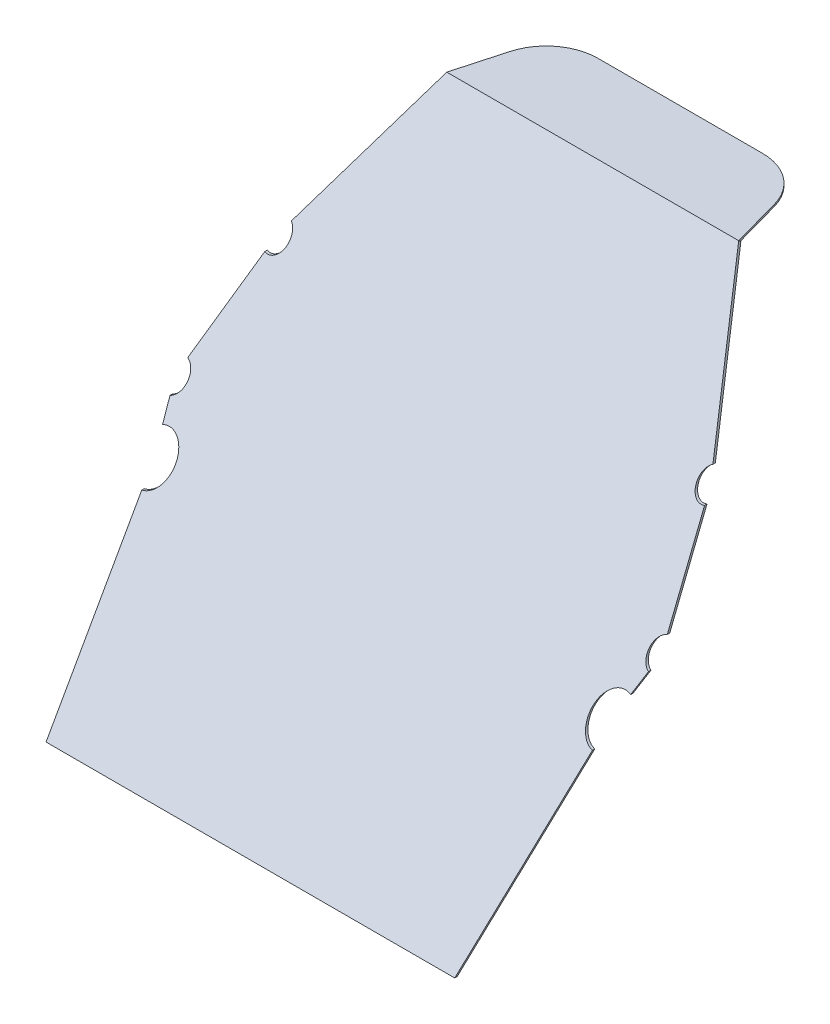
ISO-10303-21;
HEADER;
FILE_DESCRIPTION(('STEP AP214'),'2;1');
FILE_NAME('part.step','',(''),(''),'','','');
FILE_SCHEMA(('AUTOMOTIVE_DESIGN { 1 0 10303 214 1 1 1 1 }'));
ENDSEC;
DATA;
#1=APPLICATION_CONTEXT('core data for automotive mechanical design processes');
#2=APPLICATION_PROTOCOL_DEFINITION('international standard','automotive_design',2000,#1);
#3=PRODUCT_CONTEXT('',#1,'mechanical');
#4=PRODUCT('Part','Part','',(#3));
#5=PRODUCT_RELATED_PRODUCT_CATEGORY('part','',(#4));
#6=PRODUCT_DEFINITION_FORMATION('','',#4);
#7=PRODUCT_DEFINITION_CONTEXT('part definition',#1,'design');
#8=PRODUCT_DEFINITION('design','',#6,#7);
#9=PRODUCT_DEFINITION_SHAPE('','',#8);
#10=(LENGTH_UNIT() NAMED_UNIT(*) SI_UNIT(.MILLI.,.METRE.));
#11=(NAMED_UNIT(*) PLANE_ANGLE_UNIT() SI_UNIT($,.RADIAN.));
#12=(NAMED_UNIT(*) SI_UNIT($,.STERADIAN.) SOLID_ANGLE_UNIT());
#13=UNCERTAINTY_MEASURE_WITH_UNIT(LENGTH_MEASURE(1.E-05),#10,'distance_accuracy_value','');
#14=(GEOMETRIC_REPRESENTATION_CONTEXT(3) GLOBAL_UNCERTAINTY_ASSIGNED_CONTEXT((#13)) GLOBAL_UNIT_ASSIGNED_CONTEXT((#10,
#11,#12)) REPRESENTATION_CONTEXT('',''));
#15=CARTESIAN_POINT('',(0.,0.,0.));
#16=DIRECTION('',(0.,0.,1.));
#17=DIRECTION('',(1.,0.,0.));
#18=AXIS2_PLACEMENT_3D('',#15,#16,#17);
#19=CARTESIAN_POINT('',(317.5,-1.56378014732707,-2.00154731416116));
#20=DIRECTION('',(0.,0.788010753606723,-0.615661475325657));
#21=DIRECTION('',(0.,0.615661475325657,0.788010753606723));
#22=AXIS2_PLACEMENT_3D('',#19,#20,#21);
#23=PLANE('',#22);
#24=DIRECTION('',(-1.,0.,0.));
#25=VECTOR('',#24,1.);
#26=CARTESIAN_POINT('',(317.5,-1.56378014732707,-2.00154731416116));
#27=LINE('',#26,#25);
#28=CARTESIAN_POINT('',(-189.945504352667,-1.56378014732718,-2.00154731416107));
#29=VERTEX_POINT('',#28);
#30=CARTESIAN_POINT('',(-191.373967183908,-1.56378014732718,-2.00154731416106));
#31=VERTEX_POINT('',#30);
#32=EDGE_CURVE('E259',#29,#31,#27,.T.);
#33=ORIENTED_EDGE('',*,*,#32,.T.);
#34=DIRECTION('',(0.32536014946533,0.582163440267825,0.745135223939541));
#35=VECTOR('',#34,1.);
#36=CARTESIAN_POINT('',(-137.504962448587,94.8234546509534,121.368487316128));
#37=LINE('',#36,#35);
#38=CARTESIAN_POINT('',(-190.5,0.,0.));
#39=VERTEX_POINT('',#38);
#40=EDGE_CURVE('E248',#31,#39,#37,.T.);
#41=ORIENTED_EDGE('',*,*,#40,.T.);
#42=DIRECTION('',(0.213282300426915,-0.601495482945957,-0.769879110198616));
#43=VECTOR('',#42,1.);
#44=CARTESIAN_POINT('',(-190.17414761564,-0.918963912651173,-1.17622017028524));
#45=LINE('',#44,#43);
#46=EDGE_CURVE('E265',#39,#29,#45,.T.);
#47=ORIENTED_EDGE('',*,*,#46,.T.);
#48=EDGE_LOOP('',(#33,#41,#47));
#49=FACE_BOUND('',#48,.T.);
#50=ADVANCED_FACE('F43',(#49),#23,.T.);
#51=CARTESIAN_POINT('',(0.,-1.56378014732717,-2.00154731416108));
#52=DIRECTION('',(0.,0.615661475325657,0.788010753606723));
#53=DIRECTION('',(0.,-0.788010753606723,0.615661475325657));
#54=AXIS2_PLACEMENT_3D('',#51,#52,#53);
#55=PLANE('',#54);
#56=DIRECTION('',(-0.403048602044893,-0.721170558678378,0.563440191755233));
#57=VECTOR('',#56,1.);
#58=CARTESIAN_POINT('',(-160.285615355569,54.0622757245558,-45.4613852261227));
#59=LINE('',#58,#57);
#60=CARTESIAN_POINT('',(-275.072911209995,-151.325406705108,115.005058917699));
#61=VERTEX_POINT('',#60);
#62=EDGE_CURVE('E251',#31,#61,#59,.T.);
#63=ORIENTED_EDGE('',*,*,#62,.F.);
#64=ORIENTED_EDGE('',*,*,#32,.F.);
#65=DIRECTION('',(0.168130890226921,0.776793168132269,-0.606897337030355));
#66=VECTOR('',#65,1.);
#67=CARTESIAN_POINT('',(-190.292910267822,-3.1688542719959,-0.747525971079552));
#68=LINE('',#67,#66);
#69=CARTESIAN_POINT('',(-190.156799610685,-2.54,-1.23884077495729));
#70=VERTEX_POINT('',#69);
#71=EDGE_CURVE('E269',#70,#29,#68,.T.);
#72=ORIENTED_EDGE('',*,*,#71,.F.);
#73=DIRECTION('',(-1.,0.,0.));
#74=VECTOR('',#73,1.);
#75=CARTESIAN_POINT('',(-107.315,-2.54,-1.23884077495729));
#76=LINE('',#75,#74);
#77=CARTESIAN_POINT('',(190.156799610685,-2.54,-1.23884077495729));
#78=VERTEX_POINT('',#77);
#79=EDGE_CURVE('E303',#78,#70,#76,.T.);
#80=ORIENTED_EDGE('',*,*,#79,.F.);
#81=DIRECTION('',(0.168130890226921,-0.776793168132269,0.606897337030355));
#82=VECTOR('',#81,1.);
#83=CARTESIAN_POINT('',(190.292910267822,-3.1688542719959,-0.747525971079552));
#84=LINE('',#83,#82);
#85=CARTESIAN_POINT('',(189.945504352667,-1.5637801473271,-2.00154731416113));
#86=VERTEX_POINT('',#85);
#87=EDGE_CURVE('E267',#86,#78,#84,.T.);
#88=ORIENTED_EDGE('',*,*,#87,.F.);
#89=CARTESIAN_POINT('',(191.373967183908,-1.56378014732712,-2.00154731416116));
#90=VERTEX_POINT('',#89);
#91=EDGE_CURVE('E260',#90,#86,#27,.T.);
#92=ORIENTED_EDGE('',*,*,#91,.F.);
#93=DIRECTION('',(0.403048602044893,-0.721170558678378,0.563440191755233));
#94=VECTOR('',#93,1.);
#95=CARTESIAN_POINT('',(160.285615355569,54.0622757245558,-45.4613852261227));
#96=LINE('',#95,#94);
#97=CARTESIAN_POINT('',(275.072911209995,-151.325406705108,115.005058917699));
#98=VERTEX_POINT('',#97);
#99=EDGE_CURVE('E245',#90,#98,#96,.T.);
#100=ORIENTED_EDGE('',*,*,#99,.T.);
#101=CARTESIAN_POINT('',(282.817683298822,-165.183044681766,125.831832286196));
#102=DIRECTION('',(0.,0.615661475325657,0.788010753606723));
#103=DIRECTION('',(0.,0.788010753606723,-0.615661475325657));
#104=AXIS2_PLACEMENT_3D('',#101,#102,#103);
#105=ELLIPSE('',#104,20.1456641642772,15.875);
#106=CARTESIAN_POINT('',(286.984028398317,-180.501569203139,137.799975314035));
#107=VERTEX_POINT('',#106);
#108=EDGE_CURVE('E241',#107,#98,#105,.F.);
#109=ORIENTED_EDGE('',*,*,#108,.F.);
#110=DIRECTION('',(0.209564715392473,-0.770512800762292,0.601990576275011));
#111=VECTOR('',#110,1.);
#112=CARTESIAN_POINT('',(227.85015043118,36.9177126977421,-32.0665845605347));
#113=LINE('',#112,#111);
#114=CARTESIAN_POINT('',(312.982021819166,-276.089162216509,212.481187807754));
#115=VERTEX_POINT('',#114);
#116=EDGE_CURVE('E238',#107,#115,#113,.T.);
#117=ORIENTED_EDGE('',*,*,#116,.T.);
#118=CARTESIAN_POINT('',(317.148366918662,-291.407686737882,224.449330835594));
#119=DIRECTION('',(0.,0.615661475325657,0.788010753606723));
#120=DIRECTION('',(0.,0.788010753606723,-0.615661475325657));
#121=AXIS2_PLACEMENT_3D('',#118,#119,#120);
#122=ELLIPSE('',#121,20.1456641642771,15.875);
#123=CARTESIAN_POINT('',(312.26908061109,-306.514247899468,236.251869937086));
#124=VERTEX_POINT('',#123);
#125=EDGE_CURVE('E236',#124,#115,#122,.F.);
#126=ORIENTED_EDGE('',*,*,#125,.F.);
#127=DIRECTION('',(0.246656603580926,0.763663542785337,-0.596639349465379));
#128=VECTOR('',#127,1.);
#129=CARTESIAN_POINT('',(385.774644682285,-78.9366413886135,58.4487570553544));
#130=LINE('',#129,#128);
#131=CARTESIAN_POINT('',(305.438079780489,-327.663433525689,252.775424679174));
#132=VERTEX_POINT('',#131);
#133=EDGE_CURVE('E234',#132,#124,#130,.T.);
#134=ORIENTED_EDGE('',*,*,#133,.F.);
#135=CARTESIAN_POINT('',(297.631221688374,-351.833931384226,271.659487241561));
#136=DIRECTION('',(0.,0.615661475325657,0.788010753606723));
#137=DIRECTION('',(0.,0.788010753606723,-0.615661475325657));
#138=AXIS2_PLACEMENT_3D('',#135,#136,#137);
#139=ELLIPSE('',#138,32.2330626628434,25.4);
#140=CARTESIAN_POINT('',(294.096224923988,-376.986740330262,291.311015337368));
#141=VERTEX_POINT('',#140);
#142=EDGE_CURVE('E232',#141,#132,#139,.F.);
#143=ORIENTED_EDGE('',*,*,#142,.F.);
#144=DIRECTION('',(0.110074710358999,0.783222261288649,-0.611920295104908));
#145=VECTOR('',#144,1.);
#146=CARTESIAN_POINT('',(342.655790494253,-31.4674777394618,21.3617817939772));
#147=LINE('',#146,#145);
#148=CARTESIAN_POINT('',(266.7,-571.92100966204,443.610358079875));
#149=VERTEX_POINT('',#148);
#150=EDGE_CURVE('E230',#149,#141,#147,.T.);
#151=ORIENTED_EDGE('',*,*,#150,.F.);
#152=DIRECTION('',(-1.,0.,0.));
#153=VECTOR('',#152,1.);
#154=CARTESIAN_POINT('',(0.,-571.92100966204,443.610358079875));
#155=LINE('',#154,#153);
#156=CARTESIAN_POINT('',(-266.7,-571.92100966204,443.610358079875));
#157=VERTEX_POINT('',#156);
#158=EDGE_CURVE('E225',#149,#157,#155,.T.);
#159=ORIENTED_EDGE('',*,*,#158,.T.);
#160=DIRECTION('',(-0.110074710358999,0.783222261288649,-0.611920295104908));
#161=VECTOR('',#160,1.);
#162=CARTESIAN_POINT('',(-342.655790494253,-31.4674777394618,21.3617817939772));
#163=LINE('',#162,#161);
#164=CARTESIAN_POINT('',(-294.096224923988,-376.986740330262,291.311015337369));
#165=VERTEX_POINT('',#164);
#166=EDGE_CURVE('E223',#157,#165,#163,.T.);
#167=ORIENTED_EDGE('',*,*,#166,.T.);
#168=CARTESIAN_POINT('',(-297.631221688374,-351.833931384226,271.659487241561));
#169=DIRECTION('',(0.,0.615661475325657,0.788010753606723));
#170=DIRECTION('',(0.,0.788010753606723,-0.615661475325657));
#171=AXIS2_PLACEMENT_3D('',#168,#169,#170);
#172=ELLIPSE('',#171,32.2330626628434,25.4);
#173=CARTESIAN_POINT('',(-305.438079780489,-327.663433525689,252.775424679174));
#174=VERTEX_POINT('',#173);
#175=EDGE_CURVE('E207',#174,#165,#172,.F.);
#176=ORIENTED_EDGE('',*,*,#175,.F.);
#177=DIRECTION('',(-0.246656603580926,0.763663542785337,-0.596639349465379));
#178=VECTOR('',#177,1.);
#179=CARTESIAN_POINT('',(-385.774644682285,-78.9366413886135,58.4487570553544));
#180=LINE('',#179,#178);
#181=CARTESIAN_POINT('',(-312.26908061109,-306.514247899468,236.251869937086));
#182=VERTEX_POINT('',#181);
#183=EDGE_CURVE('E200',#174,#182,#180,.T.);
#184=ORIENTED_EDGE('',*,*,#183,.T.);
#185=CARTESIAN_POINT('',(-317.148366918662,-291.407686737882,224.449330835594));
#186=DIRECTION('',(0.,0.615661475325657,0.788010753606723));
#187=DIRECTION('',(0.,0.788010753606723,-0.615661475325657));
#188=AXIS2_PLACEMENT_3D('',#185,#186,#187);
#189=ELLIPSE('',#188,20.1456641642771,15.875);
#190=CARTESIAN_POINT('',(-312.982021819166,-276.089162216508,212.481187807754));
#191=VERTEX_POINT('',#190);
#192=EDGE_CURVE('E257',#191,#182,#189,.F.);
#193=ORIENTED_EDGE('',*,*,#192,.F.);
#194=DIRECTION('',(-0.209564715392473,-0.770512800762292,0.601990576275011));
#195=VECTOR('',#194,1.);
#196=CARTESIAN_POINT('',(-227.85015043118,36.9177126977421,-32.0665845605347));
#197=LINE('',#196,#195);
#198=CARTESIAN_POINT('',(-286.984028398317,-180.50156920314,137.799975314036));
#199=VERTEX_POINT('',#198);
#200=EDGE_CURVE('E255',#199,#191,#197,.T.);
#201=ORIENTED_EDGE('',*,*,#200,.F.);
#202=CARTESIAN_POINT('',(-282.817683298822,-165.183044681766,125.831832286196));
#203=DIRECTION('',(0.,0.615661475325657,0.788010753606723));
#204=DIRECTION('',(0.,0.788010753606723,-0.615661475325657));
#205=AXIS2_PLACEMENT_3D('',#202,#203,#204);
#206=ELLIPSE('',#205,20.1456641642772,15.875);
#207=EDGE_CURVE('E253',#61,#199,#206,.F.);
#208=ORIENTED_EDGE('',*,*,#207,.F.);
#209=EDGE_LOOP('',(#63,#64,#72,#80,#88,#92,#100,#109,#117,#126,#134,#143,#151,#159,#167,#176,
#184,#193,#201,#208));
#210=FACE_BOUND('',#209,.T.);
#211=ADVANCED_FACE('F221',(#210),#55,.F.);
#212=CARTESIAN_POINT('',(0.,0.,0.));
#213=DIRECTION('',(0.,0.615661475325657,0.788010753606723));
#214=DIRECTION('',(0.,-0.788010753606723,0.615661475325657));
#215=AXIS2_PLACEMENT_3D('',#212,#213,#214);
#216=PLANE('',#215);
#217=DIRECTION('',(1.,0.,0.));
#218=VECTOR('',#217,1.);
#219=CARTESIAN_POINT('',(-190.5,0.,0.));
#220=LINE('',#219,#218);
#221=CARTESIAN_POINT('',(190.5,0.,0.));
#222=VERTEX_POINT('',#221);
#223=EDGE_CURVE('E288',#39,#222,#220,.T.);
#224=ORIENTED_EDGE('',*,*,#223,.F.);
#225=DIRECTION('',(-0.403048602044893,-0.721170558678378,0.563440191755233));
#226=VECTOR('',#225,1.);
#227=CARTESIAN_POINT('',(-159.55362254623,55.372022639894,-43.2613653991535));
#228=LINE('',#227,#226);
#229=CARTESIAN_POINT('',(-275.072911209995,-151.325406705108,118.228365183984));
#230=VERTEX_POINT('',#229);
#231=EDGE_CURVE('E11',#39,#230,#228,.T.);
#232=ORIENTED_EDGE('',*,*,#231,.T.);
#233=CARTESIAN_POINT('',(-282.817683298822,-165.183044681766,129.05513855248));
#234=DIRECTION('',(0.,0.615661475325657,0.788010753606723));
#235=DIRECTION('',(0.,0.788010753606723,-0.615661475325657));
#236=AXIS2_PLACEMENT_3D('',#233,#234,#235);
#237=ELLIPSE('',#236,20.1456641642772,15.875);
#238=CARTESIAN_POINT('',(-286.984028398317,-180.50156920314,141.02328158032));
#239=VERTEX_POINT('',#238);
#240=EDGE_CURVE('E51',#230,#239,#237,.F.);
#241=ORIENTED_EDGE('',*,*,#240,.T.);
#242=DIRECTION('',(-0.209564715392473,-0.770512800762292,0.601990576275011));
#243=VECTOR('',#242,1.);
#244=CARTESIAN_POINT('',(-227.443511058113,38.4128157338381,-30.0113808064987));
#245=LINE('',#244,#243);
#246=CARTESIAN_POINT('',(-312.982021819166,-276.089162216509,215.704494074039));
#247=VERTEX_POINT('',#246);
#248=EDGE_CURVE('E340',#239,#247,#245,.T.);
#249=ORIENTED_EDGE('',*,*,#248,.T.);
#250=CARTESIAN_POINT('',(-317.148366918662,-291.407686737882,227.672637101878));
#251=DIRECTION('',(0.,0.615661475325657,0.788010753606723));
#252=DIRECTION('',(0.,0.788010753606723,-0.615661475325657));
#253=AXIS2_PLACEMENT_3D('',#250,#251,#252);
#254=ELLIPSE('',#253,20.1456641642771,15.875);
#255=CARTESIAN_POINT('',(-312.26908061109,-306.514247899468,239.47517620337));
#256=VERTEX_POINT('',#255);
#257=EDGE_CURVE('E337',#247,#256,#254,.F.);
#258=ORIENTED_EDGE('',*,*,#257,.T.);
#259=DIRECTION('',(-0.246656603580926,0.763663542785337,-0.596639349465379));
#260=VECTOR('',#259,1.);
#261=CARTESIAN_POINT('',(-386.249002663396,-77.4680008124249,60.524635548958));
#262=LINE('',#261,#260);
#263=CARTESIAN_POINT('',(-305.438079780489,-327.663433525688,255.998730945459));
#264=VERTEX_POINT('',#263);
#265=EDGE_CURVE('E311',#264,#256,#262,.T.);
#266=ORIENTED_EDGE('',*,*,#265,.F.);
#267=CARTESIAN_POINT('',(-297.631221688374,-351.833931384226,274.882793507845));
#268=DIRECTION('',(0.,0.615661475325657,0.788010753606723));
#269=DIRECTION('',(0.,0.788010753606723,-0.615661475325657));
#270=AXIS2_PLACEMENT_3D('',#267,#268,#269);
#271=ELLIPSE('',#270,32.2330626628434,25.4);
#272=CARTESIAN_POINT('',(-294.096224923988,-376.986740330262,294.534321603653));
#273=VERTEX_POINT('',#272);
#274=EDGE_CURVE('E215',#264,#273,#271,.F.);
#275=ORIENTED_EDGE('',*,*,#274,.T.);
#276=DIRECTION('',(-0.110074710358999,0.783222261288649,-0.611920295104908));
#277=VECTOR('',#276,1.);
#278=CARTESIAN_POINT('',(-342.872902570837,-29.9226450433725,23.3781324794493));
#279=LINE('',#278,#277);
#280=CARTESIAN_POINT('',(-266.7,-571.92100966204,446.83366434616));
#281=VERTEX_POINT('',#280);
#282=EDGE_CURVE('E314',#281,#273,#279,.T.);
#283=ORIENTED_EDGE('',*,*,#282,.F.);
#284=DIRECTION('',(-1.,0.,0.));
#285=VECTOR('',#284,1.);
#286=CARTESIAN_POINT('',(0.,-571.92100966204,446.83366434616));
#287=LINE('',#286,#285);
#288=CARTESIAN_POINT('',(266.7,-571.92100966204,446.83366434616));
#289=VERTEX_POINT('',#288);
#290=EDGE_CURVE('E316',#289,#281,#287,.T.);
#291=ORIENTED_EDGE('',*,*,#290,.F.);
#292=DIRECTION('',(0.110074710358999,0.783222261288649,-0.611920295104908));
#293=VECTOR('',#292,1.);
#294=CARTESIAN_POINT('',(342.872902570837,-29.9226450433725,23.3781324794493));
#295=LINE('',#294,#293);
#296=CARTESIAN_POINT('',(294.096224923988,-376.986740330262,294.534321603653));
#297=VERTEX_POINT('',#296);
#298=EDGE_CURVE('E318',#289,#297,#295,.T.);
#299=ORIENTED_EDGE('',*,*,#298,.T.);
#300=CARTESIAN_POINT('',(297.631221688374,-351.833931384226,274.882793507845));
#301=DIRECTION('',(0.,0.615661475325657,0.788010753606723));
#302=DIRECTION('',(0.,0.788010753606723,-0.615661475325657));
#303=AXIS2_PLACEMENT_3D('',#300,#301,#302);
#304=ELLIPSE('',#303,32.2330626628434,25.4);
#305=CARTESIAN_POINT('',(305.438079780489,-327.663433525689,255.998730945459));
#306=VERTEX_POINT('',#305);
#307=EDGE_CURVE('E321',#297,#306,#304,.F.);
#308=ORIENTED_EDGE('',*,*,#307,.T.);
#309=DIRECTION('',(0.246656603580926,0.763663542785337,-0.596639349465379));
#310=VECTOR('',#309,1.);
#311=CARTESIAN_POINT('',(386.249002663396,-77.4680008124249,60.524635548958));
#312=LINE('',#311,#310);
#313=CARTESIAN_POINT('',(312.26908061109,-306.514247899468,239.47517620337));
#314=VERTEX_POINT('',#313);
#315=EDGE_CURVE('E324',#306,#314,#312,.T.);
#316=ORIENTED_EDGE('',*,*,#315,.T.);
#317=CARTESIAN_POINT('',(317.148366918662,-291.407686737882,227.672637101878));
#318=DIRECTION('',(0.,0.615661475325657,0.788010753606723));
#319=DIRECTION('',(0.,0.788010753606723,-0.615661475325657));
#320=AXIS2_PLACEMENT_3D('',#317,#318,#319);
#321=ELLIPSE('',#320,20.1456641642771,15.875);
#322=CARTESIAN_POINT('',(312.982021819166,-276.089162216509,215.704494074039));
#323=VERTEX_POINT('',#322);
#324=EDGE_CURVE('E327',#314,#323,#321,.F.);
#325=ORIENTED_EDGE('',*,*,#324,.T.);
#326=DIRECTION('',(0.209564715392473,-0.770512800762292,0.601990576275011));
#327=VECTOR('',#326,1.);
#328=CARTESIAN_POINT('',(227.443511058113,38.4128157338381,-30.0113808064987));
#329=LINE('',#328,#327);
#330=CARTESIAN_POINT('',(286.984028398317,-180.501569203139,141.02328158032));
#331=VERTEX_POINT('',#330);
#332=EDGE_CURVE('E330',#331,#323,#329,.T.);
#333=ORIENTED_EDGE('',*,*,#332,.F.);
#334=CARTESIAN_POINT('',(282.817683298822,-165.183044681766,129.05513855248));
#335=DIRECTION('',(0.,0.615661475325657,0.788010753606723));
#336=DIRECTION('',(0.,0.788010753606723,-0.615661475325657));
#337=AXIS2_PLACEMENT_3D('',#334,#335,#336);
#338=ELLIPSE('',#337,20.1456641642772,15.875);
#339=CARTESIAN_POINT('',(275.072911209995,-151.325406705108,118.228365183984));
#340=VERTEX_POINT('',#339);
#341=EDGE_CURVE('E332',#331,#340,#338,.F.);
#342=ORIENTED_EDGE('',*,*,#341,.T.);
#343=DIRECTION('',(0.403048602044893,-0.721170558678378,0.563440191755233));
#344=VECTOR('',#343,1.);
#345=CARTESIAN_POINT('',(159.55362254623,55.372022639894,-43.2613653991535));
#346=LINE('',#345,#344);
#347=EDGE_CURVE('E335',#222,#340,#346,.T.);
#348=ORIENTED_EDGE('',*,*,#347,.F.);
#349=EDGE_LOOP('',(#224,#232,#241,#249,#258,#266,#275,#283,#291,#299,#308,#316,#325,#333,#342,#348));
#350=FACE_BOUND('',#349,.T.);
#351=ADVANCED_FACE('F345',(#350),#216,.T.);
#352=CARTESIAN_POINT('',(-107.315,-2.54,-46.5666666666667));
#353=DIRECTION('',(0.,-1.,0.));
#354=DIRECTION('',(0.,0.,-1.));
#355=AXIS2_PLACEMENT_3D('',#352,#353,#354);
#356=PLANE('',#355);
#357=DIRECTION('',(-0.266977912532957,0.,-0.963702648237279));
#358=VECTOR('',#357,1.);
#359=CARTESIAN_POINT('',(190.5,-2.54,0.));
#360=LINE('',#359,#358);
#361=CARTESIAN_POINT('',(172.589792707272,-2.54,-64.649970608899));
#362=VERTEX_POINT('',#361);
#363=EDGE_CURVE('E93',#78,#362,#360,.T.);
#364=ORIENTED_EDGE('',*,*,#363,.F.);
#365=ORIENTED_EDGE('',*,*,#79,.T.);
#366=DIRECTION('',(-0.266977912532957,0.,0.963702648237279));
#367=VECTOR('',#366,1.);
#368=CARTESIAN_POINT('',(-190.5,-2.54,0.));
#369=LINE('',#368,#367);
#370=CARTESIAN_POINT('',(-172.589792707272,-2.54,-64.649970608899));
#371=VERTEX_POINT('',#370);
#372=EDGE_CURVE('E273',#371,#70,#369,.T.);
#373=ORIENTED_EDGE('',*,*,#372,.F.);
#374=CARTESIAN_POINT('',(-107.315,-2.54,-46.5666666666667));
#375=DIRECTION('',(0.,1.,0.));
#376=DIRECTION('',(0.,0.,-1.));
#377=AXIS2_PLACEMENT_3D('',#374,#375,#376);
#378=CIRCLE('',#377,67.7333333333333);
#379=CARTESIAN_POINT('',(-107.315,-2.54,-114.3));
#380=VERTEX_POINT('',#379);
#381=EDGE_CURVE('E283',#380,#371,#378,.T.);
#382=ORIENTED_EDGE('',*,*,#381,.F.);
#383=DIRECTION('',(-1.,0.,0.));
#384=VECTOR('',#383,1.);
#385=CARTESIAN_POINT('',(-107.315,-2.54,-114.3));
#386=LINE('',#385,#384);
#387=CARTESIAN_POINT('',(107.315,-2.54,-114.3));
#388=VERTEX_POINT('',#387);
#389=EDGE_CURVE('E280',#388,#380,#386,.T.);
#390=ORIENTED_EDGE('',*,*,#389,.F.);
#391=CARTESIAN_POINT('',(107.315,-2.54,-46.5666666666667));
#392=DIRECTION('',(0.,1.,0.));
#393=DIRECTION('',(0.,0.,1.));
#394=AXIS2_PLACEMENT_3D('',#391,#392,#393);
#395=CIRCLE('',#394,67.7333333333333);
#396=EDGE_CURVE('E277',#362,#388,#395,.T.);
#397=ORIENTED_EDGE('',*,*,#396,.F.);
#398=EDGE_LOOP('',(#364,#365,#373,#382,#390,#397));
#399=FACE_BOUND('',#398,.T.);
#400=ADVANCED_FACE('F412',(#399),#356,.T.);
#401=CARTESIAN_POINT('',(-190.5,-2.54,0.));
#402=DIRECTION('',(-0.963702648237279,0.,-0.266977912532957));
#403=DIRECTION('',(-0.266977912532957,0.,0.963702648237279));
#404=AXIS2_PLACEMENT_3D('',#401,#402,#403);
#405=PLANE('',#404);
#406=ORIENTED_EDGE('',*,*,#46,.F.);
#407=DIRECTION('',(-0.266977912532957,0.,0.963702648237279));
#408=VECTOR('',#407,1.);
#409=CARTESIAN_POINT('',(-190.5,0.,0.));
#410=LINE('',#409,#408);
#411=CARTESIAN_POINT('',(-172.589792707272,0.,-64.649970608899));
#412=VERTEX_POINT('',#411);
#413=EDGE_CURVE('E272',#412,#39,#410,.T.);
#414=ORIENTED_EDGE('',*,*,#413,.F.);
#415=DIRECTION('',(0.,1.,0.));
#416=VECTOR('',#415,1.);
#417=CARTESIAN_POINT('',(-172.589792707272,-2.54,-64.649970608899));
#418=LINE('',#417,#416);
#419=EDGE_CURVE('E67',#371,#412,#418,.T.);
#420=ORIENTED_EDGE('',*,*,#419,.F.);
#421=ORIENTED_EDGE('',*,*,#372,.T.);
#422=ORIENTED_EDGE('',*,*,#71,.T.);
#423=EDGE_LOOP('',(#406,#414,#420,#421,#422));
#424=FACE_BOUND('',#423,.T.);
#425=ADVANCED_FACE('F45',(#424),#405,.T.);
#426=CARTESIAN_POINT('',(-107.315,-2.54,-46.5666666666667));
#427=DIRECTION('',(0.,1.,0.));
#428=DIRECTION('',(0.,0.,1.));
#429=AXIS2_PLACEMENT_3D('',#426,#427,#428);
#430=CYLINDRICAL_SURFACE('',#429,67.7333333333333);
#431=CARTESIAN_POINT('',(-107.315,0.,-46.5666666666667));
#432=DIRECTION('',(0.,1.,0.));
#433=DIRECTION('',(0.,0.,-1.));
#434=AXIS2_PLACEMENT_3D('',#431,#432,#433);
#435=CIRCLE('',#434,67.7333333333333);
#436=CARTESIAN_POINT('',(-107.315,0.,-114.3));
#437=VERTEX_POINT('',#436);
#438=EDGE_CURVE('E275',#437,#412,#435,.T.);
#439=ORIENTED_EDGE('',*,*,#438,.F.);
#440=DIRECTION('',(0.,1.,0.));
#441=VECTOR('',#440,1.);
#442=CARTESIAN_POINT('',(-107.315,-2.54,-114.3));
#443=LINE('',#442,#441);
#444=EDGE_CURVE('E304',#380,#437,#443,.T.);
#445=ORIENTED_EDGE('',*,*,#444,.F.);
#446=ORIENTED_EDGE('',*,*,#381,.T.);
#447=ORIENTED_EDGE('',*,*,#419,.T.);
#448=EDGE_LOOP('',(#439,#445,#446,#447));
#449=FACE_BOUND('',#448,.T.);
#450=ADVANCED_FACE('F420',(#449),#430,.T.);
#451=CARTESIAN_POINT('',(-107.315,-2.54,-114.3));
#452=DIRECTION('',(0.,0.,-1.));
#453=DIRECTION('',(-1.,0.,0.));
#454=AXIS2_PLACEMENT_3D('',#451,#452,#453);
#455=PLANE('',#454);
#456=DIRECTION('',(-1.,0.,0.));
#457=VECTOR('',#456,1.);
#458=CARTESIAN_POINT('',(-107.315,0.,-114.3));
#459=LINE('',#458,#457);
#460=CARTESIAN_POINT('',(107.315,0.,-114.3));
#461=VERTEX_POINT('',#460);
#462=EDGE_CURVE('E297',#461,#437,#459,.T.);
#463=ORIENTED_EDGE('',*,*,#462,.F.);
#464=DIRECTION('',(0.,1.,0.));
#465=VECTOR('',#464,1.);
#466=CARTESIAN_POINT('',(107.315,-2.54,-114.3));
#467=LINE('',#466,#465);
#468=EDGE_CURVE('E306',#388,#461,#467,.T.);
#469=ORIENTED_EDGE('',*,*,#468,.F.);
#470=ORIENTED_EDGE('',*,*,#389,.T.);
#471=ORIENTED_EDGE('',*,*,#444,.T.);
#472=EDGE_LOOP('',(#463,#469,#470,#471));
#473=FACE_BOUND('',#472,.T.);
#474=ADVANCED_FACE('F421',(#473),#455,.T.);
#475=CARTESIAN_POINT('',(107.315,-2.54,-46.5666666666667));
#476=DIRECTION('',(0.,1.,0.));
#477=DIRECTION('',(0.,0.,1.));
#478=AXIS2_PLACEMENT_3D('',#475,#476,#477);
#479=CYLINDRICAL_SURFACE('',#478,67.7333333333333);
#480=CARTESIAN_POINT('',(107.315,0.,-46.5666666666667));
#481=DIRECTION('',(0.,1.,0.));
#482=DIRECTION('',(0.,0.,1.));
#483=AXIS2_PLACEMENT_3D('',#480,#481,#482);
#484=CIRCLE('',#483,67.7333333333333);
#485=CARTESIAN_POINT('',(172.589792707272,0.,-64.649970608899));
#486=VERTEX_POINT('',#485);
#487=EDGE_CURVE('E294',#486,#461,#484,.T.);
#488=ORIENTED_EDGE('',*,*,#487,.F.);
#489=DIRECTION('',(0.,1.,0.));
#490=VECTOR('',#489,1.);
#491=CARTESIAN_POINT('',(172.589792707272,-2.54,-64.649970608899));
#492=LINE('',#491,#490);
#493=EDGE_CURVE('E285',#362,#486,#492,.T.);
#494=ORIENTED_EDGE('',*,*,#493,.F.);
#495=ORIENTED_EDGE('',*,*,#396,.T.);
#496=ORIENTED_EDGE('',*,*,#468,.T.);
#497=EDGE_LOOP('',(#488,#494,#495,#496));
#498=FACE_BOUND('',#497,.T.);
#499=ADVANCED_FACE('F417',(#498),#479,.T.);
#500=CARTESIAN_POINT('',(190.5,-2.54,0.));
#501=DIRECTION('',(0.963702648237279,0.,-0.266977912532957));
#502=DIRECTION('',(-0.266977912532957,0.,-0.963702648237279));
#503=AXIS2_PLACEMENT_3D('',#500,#501,#502);
#504=PLANE('',#503);
#505=DIRECTION('',(0.213282300426915,0.601495482945957,0.769879110198616));
#506=VECTOR('',#505,1.);
#507=CARTESIAN_POINT('',(190.17414761564,-0.91896391265108,-1.17622017028531));
#508=LINE('',#507,#506);
#509=EDGE_CURVE('E262',#86,#222,#508,.T.);
#510=ORIENTED_EDGE('',*,*,#509,.F.);
#511=ORIENTED_EDGE('',*,*,#87,.T.);
#512=ORIENTED_EDGE('',*,*,#363,.T.);
#513=ORIENTED_EDGE('',*,*,#493,.T.);
#514=DIRECTION('',(-0.266977912532957,0.,-0.963702648237279));
#515=VECTOR('',#514,1.);
#516=CARTESIAN_POINT('',(190.5,0.,0.));
#517=LINE('',#516,#515);
#518=EDGE_CURVE('E291',#222,#486,#517,.T.);
#519=ORIENTED_EDGE('',*,*,#518,.F.);
#520=EDGE_LOOP('',(#510,#511,#512,#513,#519));
#521=FACE_BOUND('',#520,.T.);
#522=ADVANCED_FACE('F397',(#521),#504,.T.);
#523=CARTESIAN_POINT('',(-107.315,0.,-46.5666666666667));
#524=DIRECTION('',(0.,-1.,0.));
#525=DIRECTION('',(0.,0.,-1.));
#526=AXIS2_PLACEMENT_3D('',#523,#524,#525);
#527=PLANE('',#526);
#528=ORIENTED_EDGE('',*,*,#413,.T.);
#529=ORIENTED_EDGE('',*,*,#223,.T.);
#530=ORIENTED_EDGE('',*,*,#518,.T.);
#531=ORIENTED_EDGE('',*,*,#487,.T.);
#532=ORIENTED_EDGE('',*,*,#462,.T.);
#533=ORIENTED_EDGE('',*,*,#438,.T.);
#534=EDGE_LOOP('',(#528,#529,#530,#531,#532,#533));
#535=FACE_BOUND('',#534,.T.);
#536=ADVANCED_FACE('F392',(#535),#527,.F.);
#537=DIRECTION('',(-0.32536014946533,0.582163440267825,0.745135223939541));
#538=VECTOR('',#537,1.);
#539=CARTESIAN_POINT('',(204.725571504752,-25.4536631501782,-32.5792031577322));
#540=LINE('',#539,#538);
#541=EDGE_CURVE('E243',#90,#222,#540,.T.);
#542=ORIENTED_EDGE('',*,*,#541,.F.);
#543=ORIENTED_EDGE('',*,*,#91,.T.);
#544=ORIENTED_EDGE('',*,*,#509,.T.);
#545=EDGE_LOOP('',(#542,#543,#544));
#546=FACE_BOUND('',#545,.T.);
#547=ADVANCED_FACE('F378',(#546),#23,.T.);
#548=CARTESIAN_POINT('',(-317.148366918662,-291.407686737882,781.890073663584));
#549=DIRECTION('',(0.,0.,-1.));
#550=DIRECTION('',(-1.,0.,0.));
#551=AXIS2_PLACEMENT_3D('',#548,#549,#550);
#552=CYLINDRICAL_SURFACE('',#551,15.875);
#553=ORIENTED_EDGE('',*,*,#192,.T.);
#554=DIRECTION('',(0.,0.,-1.));
#555=VECTOR('',#554,1.);
#556=CARTESIAN_POINT('',(-312.26908061109,-306.514247899468,781.890073663584));
#557=LINE('',#556,#555);
#558=EDGE_CURVE('E203',#256,#182,#557,.T.);
#559=ORIENTED_EDGE('',*,*,#558,.F.);
#560=ORIENTED_EDGE('',*,*,#257,.F.);
#561=DIRECTION('',(0.,0.,-1.));
#562=VECTOR('',#561,1.);
#563=CARTESIAN_POINT('',(-312.982021819166,-276.089162216509,781.890073663584));
#564=LINE('',#563,#562);
#565=EDGE_CURVE('E208',#247,#191,#564,.T.);
#566=ORIENTED_EDGE('',*,*,#565,.T.);
#567=EDGE_LOOP('',(#553,#559,#560,#566));
#568=FACE_BOUND('',#567,.T.);
#569=ADVANCED_FACE('F367',(#568),#552,.F.);
#570=CARTESIAN_POINT('',(-221.505506589186,60.2452527723146,781.890073663584));
#571=DIRECTION('',(-0.964946426543196,0.262446935401265,0.));
#572=DIRECTION('',(-0.262446935401265,-0.964946426543196,0.));
#573=AXIS2_PLACEMENT_3D('',#570,#571,#572);
#574=PLANE('',#573);
#575=ORIENTED_EDGE('',*,*,#200,.T.);
#576=ORIENTED_EDGE('',*,*,#565,.F.);
#577=ORIENTED_EDGE('',*,*,#248,.F.);
#578=DIRECTION('',(0.,0.,-1.));
#579=VECTOR('',#578,1.);
#580=CARTESIAN_POINT('',(-286.984028398317,-180.50156920314,781.890073663584));
#581=LINE('',#580,#579);
#582=EDGE_CURVE('E354',#239,#199,#581,.T.);
#583=ORIENTED_EDGE('',*,*,#582,.T.);
#584=EDGE_LOOP('',(#575,#576,#577,#583));
#585=FACE_BOUND('',#584,.T.);
#586=ADVANCED_FACE('F370',(#585),#574,.T.);
#587=CARTESIAN_POINT('',(-282.817683298822,-165.183044681766,781.890073663584));
#588=DIRECTION('',(0.,0.,-1.));
#589=DIRECTION('',(-1.,0.,0.));
#590=AXIS2_PLACEMENT_3D('',#587,#588,#589);
#591=CYLINDRICAL_SURFACE('',#590,15.875);
#592=ORIENTED_EDGE('',*,*,#207,.T.);
#593=ORIENTED_EDGE('',*,*,#582,.F.);
#594=ORIENTED_EDGE('',*,*,#240,.F.);
#595=DIRECTION('',(0.,0.,-1.));
#596=VECTOR('',#595,1.);
#597=CARTESIAN_POINT('',(-275.072911209995,-151.325406705108,781.890073663584));
#598=LINE('',#597,#596);
#599=EDGE_CURVE('E351',#230,#61,#598,.T.);
#600=ORIENTED_EDGE('',*,*,#599,.T.);
#601=EDGE_LOOP('',(#592,#593,#594,#600));
#602=FACE_BOUND('',#601,.T.);
#603=ADVANCED_FACE('F350',(#602),#591,.F.);
#604=CARTESIAN_POINT('',(-145.15965754365,81.126990477125,781.890073663584));
#605=DIRECTION('',(-0.872922077269811,0.487859659138731,0.));
#606=DIRECTION('',(-0.487859659138731,-0.872922077269811,0.));
#607=AXIS2_PLACEMENT_3D('',#604,#605,#606);
#608=PLANE('',#607);
#609=ORIENTED_EDGE('',*,*,#62,.T.);
#610=ORIENTED_EDGE('',*,*,#599,.F.);
#611=ORIENTED_EDGE('',*,*,#231,.F.);
#612=ORIENTED_EDGE('',*,*,#40,.F.);
#613=EDGE_LOOP('',(#609,#610,#611,#612));
#614=FACE_BOUND('',#613,.T.);
#615=ADVANCED_FACE('F356',(#614),#608,.T.);
#616=CARTESIAN_POINT('',(145.15965754365,81.126990477125,781.890073663584));
#617=DIRECTION('',(-0.872922077269811,-0.487859659138731,0.));
#618=DIRECTION('',(0.487859659138731,-0.872922077269811,0.));
#619=AXIS2_PLACEMENT_3D('',#616,#617,#618);
#620=PLANE('',#619);
#621=ORIENTED_EDGE('',*,*,#541,.T.);
#622=ORIENTED_EDGE('',*,*,#347,.T.);
#623=DIRECTION('',(0.,0.,-1.));
#624=VECTOR('',#623,1.);
#625=CARTESIAN_POINT('',(275.072911209995,-151.325406705108,781.890073663584));
#626=LINE('',#625,#624);
#627=EDGE_CURVE('E357',#340,#98,#626,.T.);
#628=ORIENTED_EDGE('',*,*,#627,.T.);
#629=ORIENTED_EDGE('',*,*,#99,.F.);
#630=EDGE_LOOP('',(#621,#622,#628,#629));
#631=FACE_BOUND('',#630,.T.);
#632=ADVANCED_FACE('F492',(#631),#620,.F.);
#633=CARTESIAN_POINT('',(282.817683298822,-165.183044681766,781.890073663584));
#634=DIRECTION('',(0.,0.,-1.));
#635=DIRECTION('',(-1.,0.,0.));
#636=AXIS2_PLACEMENT_3D('',#633,#634,#635);
#637=CYLINDRICAL_SURFACE('',#636,15.875);
#638=ORIENTED_EDGE('',*,*,#108,.T.);
#639=ORIENTED_EDGE('',*,*,#627,.F.);
#640=ORIENTED_EDGE('',*,*,#341,.F.);
#641=DIRECTION('',(0.,0.,-1.));
#642=VECTOR('',#641,1.);
#643=CARTESIAN_POINT('',(286.984028398317,-180.50156920314,781.890073663584));
#644=LINE('',#643,#642);
#645=EDGE_CURVE('E361',#331,#107,#644,.T.);
#646=ORIENTED_EDGE('',*,*,#645,.T.);
#647=EDGE_LOOP('',(#638,#639,#640,#646));
#648=FACE_BOUND('',#647,.T.);
#649=ADVANCED_FACE('F501',(#648),#637,.F.);
#650=CARTESIAN_POINT('',(221.505506589186,60.2452527723146,781.890073663584));
#651=DIRECTION('',(-0.964946426543196,-0.262446935401265,0.));
#652=DIRECTION('',(0.262446935401265,-0.964946426543196,0.));
#653=AXIS2_PLACEMENT_3D('',#650,#651,#652);
#654=PLANE('',#653);
#655=ORIENTED_EDGE('',*,*,#645,.F.);
#656=ORIENTED_EDGE('',*,*,#332,.T.);
#657=DIRECTION('',(0.,0.,-1.));
#658=VECTOR('',#657,1.);
#659=CARTESIAN_POINT('',(312.982021819166,-276.089162216509,781.890073663584));
#660=LINE('',#659,#658);
#661=EDGE_CURVE('E620',#323,#115,#660,.T.);
#662=ORIENTED_EDGE('',*,*,#661,.T.);
#663=ORIENTED_EDGE('',*,*,#116,.F.);
#664=EDGE_LOOP('',(#655,#656,#662,#663));
#665=FACE_BOUND('',#664,.T.);
#666=ADVANCED_FACE('F510',(#665),#654,.F.);
#667=CARTESIAN_POINT('',(317.148366918662,-291.407686737882,781.890073663584));
#668=DIRECTION('',(0.,0.,-1.));
#669=DIRECTION('',(-1.,0.,0.));
#670=AXIS2_PLACEMENT_3D('',#667,#668,#669);
#671=CYLINDRICAL_SURFACE('',#670,15.875);
#672=ORIENTED_EDGE('',*,*,#125,.T.);
#673=ORIENTED_EDGE('',*,*,#661,.F.);
#674=ORIENTED_EDGE('',*,*,#324,.F.);
#675=DIRECTION('',(0.,0.,-1.));
#676=VECTOR('',#675,1.);
#677=CARTESIAN_POINT('',(312.26908061109,-306.514247899468,781.890073663584));
#678=LINE('',#677,#676);
#679=EDGE_CURVE('E617',#314,#124,#678,.T.);
#680=ORIENTED_EDGE('',*,*,#679,.T.);
#681=EDGE_LOOP('',(#672,#673,#674,#680));
#682=FACE_BOUND('',#681,.T.);
#683=ADVANCED_FACE('F520',(#682),#671,.F.);
#684=CARTESIAN_POINT('',(372.418547742767,-120.28791339407,781.890073663584));
#685=DIRECTION('',(0.951594403879439,-0.307356617799805,0.));
#686=DIRECTION('',(0.307356617799805,0.951594403879439,0.));
#687=AXIS2_PLACEMENT_3D('',#684,#685,#686);
#688=PLANE('',#687);
#689=ORIENTED_EDGE('',*,*,#133,.T.);
#690=ORIENTED_EDGE('',*,*,#679,.F.);
#691=ORIENTED_EDGE('',*,*,#315,.F.);
#692=DIRECTION('',(0.,0.,-1.));
#693=VECTOR('',#692,1.);
#694=CARTESIAN_POINT('',(305.438079780489,-327.663433525689,781.890073663584));
#695=LINE('',#694,#693);
#696=EDGE_CURVE('E614',#306,#132,#695,.T.);
#697=ORIENTED_EDGE('',*,*,#696,.T.);
#698=EDGE_LOOP('',(#689,#690,#691,#697));
#699=FACE_BOUND('',#698,.T.);
#700=ADVANCED_FACE('F530',(#699),#688,.T.);
#701=CARTESIAN_POINT('',(297.631221688374,-351.833931384226,781.890073663584));
#702=DIRECTION('',(0.,0.,-1.));
#703=DIRECTION('',(-1.,0.,0.));
#704=AXIS2_PLACEMENT_3D('',#701,#702,#703);
#705=CYLINDRICAL_SURFACE('',#704,25.4);
#706=ORIENTED_EDGE('',*,*,#142,.T.);
#707=ORIENTED_EDGE('',*,*,#696,.F.);
#708=ORIENTED_EDGE('',*,*,#307,.F.);
#709=DIRECTION('',(0.,0.,-1.));
#710=VECTOR('',#709,1.);
#711=CARTESIAN_POINT('',(294.096224923988,-376.986740330262,781.890073663584));
#712=LINE('',#711,#710);
#713=EDGE_CURVE('E611',#297,#141,#712,.T.);
#714=ORIENTED_EDGE('',*,*,#713,.T.);
#715=EDGE_LOOP('',(#706,#707,#708,#714));
#716=FACE_BOUND('',#715,.T.);
#717=ADVANCED_FACE('F540',(#716),#705,.F.);
#718=CARTESIAN_POINT('',(340.35564457309,-47.8338663839714,781.890073663584));
#719=DIRECTION('',(0.990268068741571,-0.139173100960062,0.));
#720=DIRECTION('',(0.139173100960062,0.990268068741571,0.));
#721=AXIS2_PLACEMENT_3D('',#718,#719,#720);
#722=PLANE('',#721);
#723=ORIENTED_EDGE('',*,*,#150,.T.);
#724=ORIENTED_EDGE('',*,*,#713,.F.);
#725=ORIENTED_EDGE('',*,*,#298,.F.);
#726=DIRECTION('',(0.,0.,-1.));
#727=VECTOR('',#726,1.);
#728=CARTESIAN_POINT('',(266.7,-571.92100966204,781.890073663584));
#729=LINE('',#728,#727);
#730=EDGE_CURVE('E603',#289,#149,#729,.T.);
#731=ORIENTED_EDGE('',*,*,#730,.T.);
#732=EDGE_LOOP('',(#723,#724,#725,#731));
#733=FACE_BOUND('',#732,.T.);
#734=ADVANCED_FACE('F550',(#733),#722,.T.);
#735=CARTESIAN_POINT('',(0.,-571.92100966204,781.890073663584));
#736=DIRECTION('',(0.,1.,0.));
#737=DIRECTION('',(0.,0.,1.));
#738=AXIS2_PLACEMENT_3D('',#735,#736,#737);
#739=PLANE('',#738);
#740=ORIENTED_EDGE('',*,*,#730,.F.);
#741=ORIENTED_EDGE('',*,*,#290,.T.);
#742=DIRECTION('',(0.,0.,-1.));
#743=VECTOR('',#742,1.);
#744=CARTESIAN_POINT('',(-266.7,-571.92100966204,781.890073663584));
#745=LINE('',#744,#743);
#746=EDGE_CURVE('E601',#281,#157,#745,.T.);
#747=ORIENTED_EDGE('',*,*,#746,.T.);
#748=ORIENTED_EDGE('',*,*,#158,.F.);
#749=EDGE_LOOP('',(#740,#741,#747,#748));
#750=FACE_BOUND('',#749,.T.);
#751=ADVANCED_FACE('F560',(#750),#739,.F.);
#752=CARTESIAN_POINT('',(-340.35564457309,-47.8338663839714,781.890073663584));
#753=DIRECTION('',(0.990268068741571,0.139173100960062,0.));
#754=DIRECTION('',(-0.139173100960062,0.990268068741571,0.));
#755=AXIS2_PLACEMENT_3D('',#752,#753,#754);
#756=PLANE('',#755);
#757=ORIENTED_EDGE('',*,*,#746,.F.);
#758=ORIENTED_EDGE('',*,*,#282,.T.);
#759=DIRECTION('',(0.,0.,-1.));
#760=VECTOR('',#759,1.);
#761=CARTESIAN_POINT('',(-294.096224923988,-376.986740330262,781.890073663584));
#762=LINE('',#761,#760);
#763=EDGE_CURVE('E217',#273,#165,#762,.T.);
#764=ORIENTED_EDGE('',*,*,#763,.T.);
#765=ORIENTED_EDGE('',*,*,#166,.F.);
#766=EDGE_LOOP('',(#757,#758,#764,#765));
#767=FACE_BOUND('',#766,.T.);
#768=ADVANCED_FACE('F570',(#767),#756,.F.);
#769=CARTESIAN_POINT('',(-297.631221688374,-351.833931384226,781.890073663584));
#770=DIRECTION('',(0.,0.,-1.));
#771=DIRECTION('',(-1.,0.,0.));
#772=AXIS2_PLACEMENT_3D('',#769,#770,#771);
#773=CYLINDRICAL_SURFACE('',#772,25.4);
#774=ORIENTED_EDGE('',*,*,#175,.T.);
#775=ORIENTED_EDGE('',*,*,#763,.F.);
#776=ORIENTED_EDGE('',*,*,#274,.F.);
#777=DIRECTION('',(0.,0.,-1.));
#778=VECTOR('',#777,1.);
#779=CARTESIAN_POINT('',(-305.438079780489,-327.663433525689,781.890073663584));
#780=LINE('',#779,#778);
#781=EDGE_CURVE('E58',#264,#174,#780,.T.);
#782=ORIENTED_EDGE('',*,*,#781,.T.);
#783=EDGE_LOOP('',(#774,#775,#776,#782));
#784=FACE_BOUND('',#783,.T.);
#785=ADVANCED_FACE('F211',(#784),#773,.F.);
#786=CARTESIAN_POINT('',(-372.418547742767,-120.28791339407,781.890073663584));
#787=DIRECTION('',(0.951594403879439,0.307356617799805,0.));
#788=DIRECTION('',(-0.307356617799805,0.951594403879439,0.));
#789=AXIS2_PLACEMENT_3D('',#786,#787,#788);
#790=PLANE('',#789);
#791=ORIENTED_EDGE('',*,*,#781,.F.);
#792=ORIENTED_EDGE('',*,*,#265,.T.);
#793=ORIENTED_EDGE('',*,*,#558,.T.);
#794=ORIENTED_EDGE('',*,*,#183,.F.);
#795=EDGE_LOOP('',(#791,#792,#793,#794));
#796=FACE_BOUND('',#795,.T.);
#797=ADVANCED_FACE('F201',(#796),#790,.F.);
#798=CLOSED_SHELL('',(#50,#211,#351,#400,#425,#450,#474,#499,#522,#536,#547,#569,#586,#603,#615,
#632,#649,#666,#683,#700,#717,#734,#751,#768,#785,#797));
#799=MANIFOLD_SOLID_BREP('B2',#798);
#800=ADVANCED_BREP_SHAPE_REPRESENTATION('',(#18,#799),#14);
#801=SHAPE_DEFINITION_REPRESENTATION(#9,#800);
ENDSEC;
END-ISO-10303-21;
